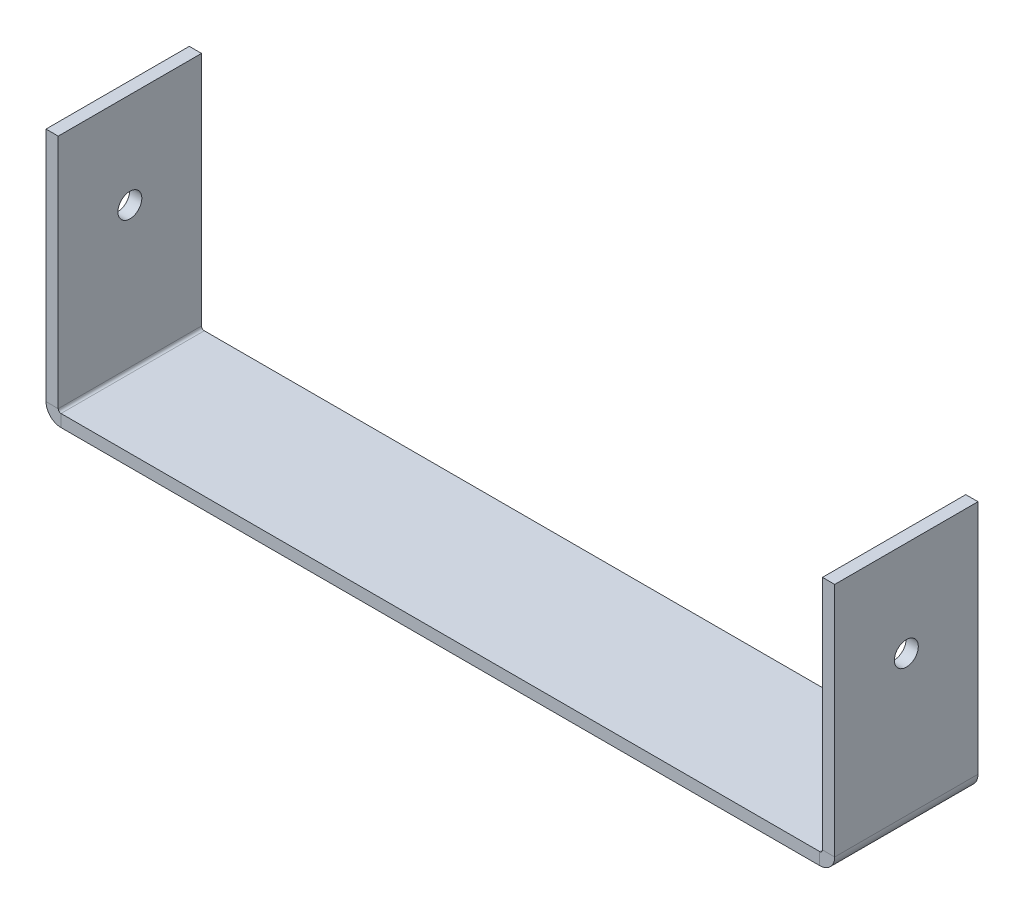
ISO-10303-21;
HEADER;
FILE_DESCRIPTION(('STEP AP214'),'2;1');
FILE_NAME('part.step','',(''),(''),'','','');
FILE_SCHEMA(('AUTOMOTIVE_DESIGN { 1 0 10303 214 1 1 1 1 }'));
ENDSEC;
DATA;
#1=APPLICATION_CONTEXT('core data for automotive mechanical design processes');
#2=APPLICATION_PROTOCOL_DEFINITION('international standard','automotive_design',2000,#1);
#3=PRODUCT_CONTEXT('',#1,'mechanical');
#4=PRODUCT('Part','Part','',(#3));
#5=PRODUCT_RELATED_PRODUCT_CATEGORY('part','',(#4));
#6=PRODUCT_DEFINITION_FORMATION('','',#4);
#7=PRODUCT_DEFINITION_CONTEXT('part definition',#1,'design');
#8=PRODUCT_DEFINITION('design','',#6,#7);
#9=PRODUCT_DEFINITION_SHAPE('','',#8);
#10=(LENGTH_UNIT() NAMED_UNIT(*) SI_UNIT(.MILLI.,.METRE.));
#11=(NAMED_UNIT(*) PLANE_ANGLE_UNIT() SI_UNIT($,.RADIAN.));
#12=(NAMED_UNIT(*) SI_UNIT($,.STERADIAN.) SOLID_ANGLE_UNIT());
#13=UNCERTAINTY_MEASURE_WITH_UNIT(LENGTH_MEASURE(1.E-05),#10,'distance_accuracy_value','');
#14=(GEOMETRIC_REPRESENTATION_CONTEXT(3) GLOBAL_UNCERTAINTY_ASSIGNED_CONTEXT((#13)) GLOBAL_UNIT_ASSIGNED_CONTEXT((#10,
#11,#12)) REPRESENTATION_CONTEXT('',''));
#15=CARTESIAN_POINT('',(0.,0.,0.));
#16=DIRECTION('',(0.,0.,1.));
#17=DIRECTION('',(1.,0.,0.));
#18=AXIS2_PLACEMENT_3D('',#15,#16,#17);
#19=CARTESIAN_POINT('',(-101.6,-3.2512,19.05));
#20=DIRECTION('',(0.,1.,0.));
#21=DIRECTION('',(0.,0.,1.));
#22=AXIS2_PLACEMENT_3D('',#19,#20,#21);
#23=PLANE('',#22);
#24=DIRECTION('',(0.,0.,-1.));
#25=VECTOR('',#24,1.);
#26=CARTESIAN_POINT('',(100.8634,-3.2512,-19.05));
#27=LINE('',#26,#25);
#28=CARTESIAN_POINT('',(100.8634,-3.2512,-19.05));
#29=VERTEX_POINT('',#28);
#30=CARTESIAN_POINT('',(100.8634,-3.2512,19.05));
#31=VERTEX_POINT('',#30);
#32=EDGE_CURVE('E135',#29,#31,#27,.F.);
#33=ORIENTED_EDGE('',*,*,#32,.T.);
#34=DIRECTION('',(1.,0.,0.));
#35=VECTOR('',#34,1.);
#36=CARTESIAN_POINT('',(-101.6,-3.2512,19.05));
#37=LINE('',#36,#35);
#38=CARTESIAN_POINT('',(-100.8634,-3.2512,19.05));
#39=VERTEX_POINT('',#38);
#40=EDGE_CURVE('E46',#39,#31,#37,.T.);
#41=ORIENTED_EDGE('',*,*,#40,.F.);
#42=DIRECTION('',(0.,0.,1.));
#43=VECTOR('',#42,1.);
#44=CARTESIAN_POINT('',(-100.8634,-3.2512,19.05));
#45=LINE('',#44,#43);
#46=CARTESIAN_POINT('',(-100.8634,-3.2512,-19.05));
#47=VERTEX_POINT('',#46);
#48=EDGE_CURVE('E224',#39,#47,#45,.F.);
#49=ORIENTED_EDGE('',*,*,#48,.T.);
#50=DIRECTION('',(-1.,0.,0.));
#51=VECTOR('',#50,1.);
#52=CARTESIAN_POINT('',(-101.6,-3.2512,-19.05));
#53=LINE('',#52,#51);
#54=EDGE_CURVE('E11',#29,#47,#53,.T.);
#55=ORIENTED_EDGE('',*,*,#54,.F.);
#56=EDGE_LOOP('',(#33,#41,#49,#55));
#57=FACE_BOUND('',#56,.T.);
#58=ADVANCED_FACE('F37',(#57),#23,.F.);
#59=CARTESIAN_POINT('',(-101.6,0.,19.05));
#60=DIRECTION('',(0.,1.,0.));
#61=DIRECTION('',(0.,0.,1.));
#62=AXIS2_PLACEMENT_3D('',#59,#60,#61);
#63=PLANE('',#62);
#64=DIRECTION('',(1.,0.,0.));
#65=VECTOR('',#64,1.);
#66=CARTESIAN_POINT('',(-101.6,0.,19.05));
#67=LINE('',#66,#65);
#68=CARTESIAN_POINT('',(-100.8634,0.,19.05));
#69=VERTEX_POINT('',#68);
#70=CARTESIAN_POINT('',(100.8634,0.,19.05));
#71=VERTEX_POINT('',#70);
#72=EDGE_CURVE('E242',#69,#71,#67,.T.);
#73=ORIENTED_EDGE('',*,*,#72,.T.);
#74=DIRECTION('',(0.,0.,-1.));
#75=VECTOR('',#74,1.);
#76=CARTESIAN_POINT('',(100.8634,0.,-19.05));
#77=LINE('',#76,#75);
#78=CARTESIAN_POINT('',(100.8634,0.,-19.05));
#79=VERTEX_POINT('',#78);
#80=EDGE_CURVE('E185',#79,#71,#77,.F.);
#81=ORIENTED_EDGE('',*,*,#80,.F.);
#82=DIRECTION('',(-1.,0.,0.));
#83=VECTOR('',#82,1.);
#84=CARTESIAN_POINT('',(-101.6,0.,-19.05));
#85=LINE('',#84,#83);
#86=CARTESIAN_POINT('',(-100.8634,0.,-19.05));
#87=VERTEX_POINT('',#86);
#88=EDGE_CURVE('E246',#79,#87,#85,.T.);
#89=ORIENTED_EDGE('',*,*,#88,.T.);
#90=DIRECTION('',(0.,0.,1.));
#91=VECTOR('',#90,1.);
#92=CARTESIAN_POINT('',(-100.8634,0.,19.05));
#93=LINE('',#92,#91);
#94=EDGE_CURVE('E54',#69,#87,#93,.F.);
#95=ORIENTED_EDGE('',*,*,#94,.F.);
#96=EDGE_LOOP('',(#73,#81,#89,#95));
#97=FACE_BOUND('',#96,.T.);
#98=ADVANCED_FACE('F249',(#97),#63,.T.);
#99=CARTESIAN_POINT('',(-101.6,-3.2512,-19.05));
#100=DIRECTION('',(0.,0.,-1.));
#101=DIRECTION('',(-1.,0.,0.));
#102=AXIS2_PLACEMENT_3D('',#99,#100,#101);
#103=PLANE('',#102);
#104=ORIENTED_EDGE('',*,*,#88,.F.);
#105=DIRECTION('',(0.,-1.,0.));
#106=VECTOR('',#105,1.);
#107=CARTESIAN_POINT('',(100.8634,0.,-19.05));
#108=LINE('',#107,#106);
#109=EDGE_CURVE('E181',#79,#29,#108,.T.);
#110=ORIENTED_EDGE('',*,*,#109,.T.);
#111=ORIENTED_EDGE('',*,*,#54,.T.);
#112=DIRECTION('',(0.,-1.,0.));
#113=VECTOR('',#112,1.);
#114=CARTESIAN_POINT('',(-100.8634,0.,-19.05));
#115=LINE('',#114,#113);
#116=EDGE_CURVE('E239',#87,#47,#115,.T.);
#117=ORIENTED_EDGE('',*,*,#116,.F.);
#118=EDGE_LOOP('',(#104,#110,#111,#117));
#119=FACE_BOUND('',#118,.T.);
#120=ADVANCED_FACE('F250',(#119),#103,.T.);
#121=CARTESIAN_POINT('',(-101.6,-3.2512,19.05));
#122=DIRECTION('',(0.,0.,1.));
#123=DIRECTION('',(1.,0.,0.));
#124=AXIS2_PLACEMENT_3D('',#121,#122,#123);
#125=PLANE('',#124);
#126=DIRECTION('',(0.,-1.,0.));
#127=VECTOR('',#126,1.);
#128=CARTESIAN_POINT('',(100.8634,0.,19.05));
#129=LINE('',#128,#127);
#130=EDGE_CURVE('E189',#71,#31,#129,.T.);
#131=ORIENTED_EDGE('',*,*,#130,.F.);
#132=ORIENTED_EDGE('',*,*,#72,.F.);
#133=DIRECTION('',(0.,-1.,0.));
#134=VECTOR('',#133,1.);
#135=CARTESIAN_POINT('',(-100.8634,0.,19.05));
#136=LINE('',#135,#134);
#137=EDGE_CURVE('E230',#69,#39,#136,.T.);
#138=ORIENTED_EDGE('',*,*,#137,.T.);
#139=ORIENTED_EDGE('',*,*,#40,.T.);
#140=EDGE_LOOP('',(#131,#132,#138,#139));
#141=FACE_BOUND('',#140,.T.);
#142=ADVANCED_FACE('F39',(#141),#125,.T.);
#143=CARTESIAN_POINT('',(-100.8634,0.736600000000006,-19.05));
#144=DIRECTION('',(0.,0.,-1.));
#145=DIRECTION('',(-1.,0.,0.));
#146=AXIS2_PLACEMENT_3D('',#143,#144,#145);
#147=PLANE('',#146);
#148=DIRECTION('',(-1.,0.,0.));
#149=VECTOR('',#148,1.);
#150=CARTESIAN_POINT('',(-101.6,0.736600000000004,-19.05));
#151=LINE('',#150,#149);
#152=CARTESIAN_POINT('',(-101.6,0.736600000000004,-19.05));
#153=VERTEX_POINT('',#152);
#154=CARTESIAN_POINT('',(-104.8512,0.736599999999992,-19.05));
#155=VERTEX_POINT('',#154);
#156=EDGE_CURVE('E192',#153,#155,#151,.T.);
#157=ORIENTED_EDGE('',*,*,#156,.F.);
#158=CARTESIAN_POINT('',(-100.8634,0.736600000000006,-19.05));
#159=DIRECTION('',(0.,0.,1.));
#160=DIRECTION('',(1.,0.,0.));
#161=AXIS2_PLACEMENT_3D('',#158,#159,#160);
#162=CIRCLE('',#161,0.736600000000004);
#163=EDGE_CURVE('E233',#87,#153,#162,.F.);
#164=ORIENTED_EDGE('',*,*,#163,.F.);
#165=ORIENTED_EDGE('',*,*,#116,.T.);
#166=CARTESIAN_POINT('',(-100.8634,0.736600000000006,-19.05));
#167=DIRECTION('',(0.,0.,1.));
#168=DIRECTION('',(1.,0.,0.));
#169=AXIS2_PLACEMENT_3D('',#166,#167,#168);
#170=CIRCLE('',#169,3.9878);
#171=EDGE_CURVE('E226',#47,#155,#170,.F.);
#172=ORIENTED_EDGE('',*,*,#171,.T.);
#173=EDGE_LOOP('',(#157,#164,#165,#172));
#174=FACE_BOUND('',#173,.T.);
#175=ADVANCED_FACE('F258',(#174),#147,.T.);
#176=CARTESIAN_POINT('',(-100.8634,0.736600000000006,19.05));
#177=DIRECTION('',(0.,0.,-1.));
#178=DIRECTION('',(-1.,0.,0.));
#179=AXIS2_PLACEMENT_3D('',#176,#177,#178);
#180=PLANE('',#179);
#181=CARTESIAN_POINT('',(-100.8634,0.736600000000006,19.05));
#182=DIRECTION('',(0.,0.,1.));
#183=DIRECTION('',(1.,0.,0.));
#184=AXIS2_PLACEMENT_3D('',#181,#182,#183);
#185=CIRCLE('',#184,0.736600000000004);
#186=CARTESIAN_POINT('',(-101.6,0.736600000000004,19.05));
#187=VERTEX_POINT('',#186);
#188=EDGE_CURVE('E223',#187,#69,#185,.T.);
#189=ORIENTED_EDGE('',*,*,#188,.F.);
#190=DIRECTION('',(-1.,0.,0.));
#191=VECTOR('',#190,1.);
#192=CARTESIAN_POINT('',(-101.6,0.736600000000004,19.05));
#193=LINE('',#192,#191);
#194=CARTESIAN_POINT('',(-104.8512,0.736599999999992,19.05));
#195=VERTEX_POINT('',#194);
#196=EDGE_CURVE('E196',#187,#195,#193,.T.);
#197=ORIENTED_EDGE('',*,*,#196,.T.);
#198=CARTESIAN_POINT('',(-100.8634,0.736600000000006,19.05));
#199=DIRECTION('',(0.,0.,1.));
#200=DIRECTION('',(1.,0.,0.));
#201=AXIS2_PLACEMENT_3D('',#198,#199,#200);
#202=CIRCLE('',#201,3.9878);
#203=EDGE_CURVE('E227',#195,#39,#202,.T.);
#204=ORIENTED_EDGE('',*,*,#203,.T.);
#205=ORIENTED_EDGE('',*,*,#137,.F.);
#206=EDGE_LOOP('',(#189,#197,#204,#205));
#207=FACE_BOUND('',#206,.T.);
#208=ADVANCED_FACE('F279',(#207),#180,.F.);
#209=CARTESIAN_POINT('',(-100.8634,0.736600000000006,19.05));
#210=DIRECTION('',(0.,0.,1.));
#211=DIRECTION('',(-1.,0.,0.));
#212=AXIS2_PLACEMENT_3D('',#209,#210,#211);
#213=CYLINDRICAL_SURFACE('',#212,3.9878);
#214=ORIENTED_EDGE('',*,*,#48,.F.);
#215=ORIENTED_EDGE('',*,*,#203,.F.);
#216=DIRECTION('',(0.,0.,-1.));
#217=VECTOR('',#216,1.);
#218=CARTESIAN_POINT('',(-104.8512,0.73659999999999,-19.05));
#219=LINE('',#218,#217);
#220=EDGE_CURVE('E199',#195,#155,#219,.T.);
#221=ORIENTED_EDGE('',*,*,#220,.T.);
#222=ORIENTED_EDGE('',*,*,#171,.F.);
#223=EDGE_LOOP('',(#214,#215,#221,#222));
#224=FACE_BOUND('',#223,.T.);
#225=ADVANCED_FACE('F500',(#224),#213,.T.);
#226=CARTESIAN_POINT('',(-100.8634,0.736600000000006,19.05));
#227=DIRECTION('',(0.,0.,1.));
#228=DIRECTION('',(-1.,0.,0.));
#229=AXIS2_PLACEMENT_3D('',#226,#227,#228);
#230=CYLINDRICAL_SURFACE('',#229,0.736600000000004);
#231=ORIENTED_EDGE('',*,*,#94,.T.);
#232=ORIENTED_EDGE('',*,*,#163,.T.);
#233=DIRECTION('',(0.,0.,1.));
#234=VECTOR('',#233,1.);
#235=CARTESIAN_POINT('',(-101.6,0.736600000000004,-19.05));
#236=LINE('',#235,#234);
#237=EDGE_CURVE('E194',#153,#187,#236,.T.);
#238=ORIENTED_EDGE('',*,*,#237,.T.);
#239=ORIENTED_EDGE('',*,*,#188,.T.);
#240=EDGE_LOOP('',(#231,#232,#238,#239));
#241=FACE_BOUND('',#240,.T.);
#242=ADVANCED_FACE('F255',(#241),#230,.F.);
#243=CARTESIAN_POINT('',(-104.8512,0.,-19.05));
#244=DIRECTION('',(0.,0.,1.));
#245=DIRECTION('',(1.,0.,0.));
#246=AXIS2_PLACEMENT_3D('',#243,#244,#245);
#247=PLANE('',#246);
#248=ORIENTED_EDGE('',*,*,#156,.T.);
#249=DIRECTION('',(0.,-1.,0.));
#250=VECTOR('',#249,1.);
#251=CARTESIAN_POINT('',(-104.8512,0.,-19.05));
#252=LINE('',#251,#250);
#253=CARTESIAN_POINT('',(-104.8512,63.5,-19.05));
#254=VERTEX_POINT('',#253);
#255=EDGE_CURVE('E204',#254,#155,#252,.T.);
#256=ORIENTED_EDGE('',*,*,#255,.F.);
#257=DIRECTION('',(1.,0.,0.));
#258=VECTOR('',#257,1.);
#259=CARTESIAN_POINT('',(-104.8512,63.5,-19.05));
#260=LINE('',#259,#258);
#261=CARTESIAN_POINT('',(-101.6,63.5,-19.05));
#262=VERTEX_POINT('',#261);
#263=EDGE_CURVE('E212',#254,#262,#260,.T.);
#264=ORIENTED_EDGE('',*,*,#263,.T.);
#265=DIRECTION('',(0.,-1.,0.));
#266=VECTOR('',#265,1.);
#267=CARTESIAN_POINT('',(-101.6,0.,-19.05));
#268=LINE('',#267,#266);
#269=EDGE_CURVE('E203',#262,#153,#268,.T.);
#270=ORIENTED_EDGE('',*,*,#269,.T.);
#271=EDGE_LOOP('',(#248,#256,#264,#270));
#272=FACE_BOUND('',#271,.T.);
#273=ADVANCED_FACE('F261',(#272),#247,.F.);
#274=CARTESIAN_POINT('',(-104.8512,63.5,19.05));
#275=DIRECTION('',(0.,0.,-1.));
#276=DIRECTION('',(0.,1.,0.));
#277=AXIS2_PLACEMENT_3D('',#274,#275,#276);
#278=PLANE('',#277);
#279=ORIENTED_EDGE('',*,*,#196,.F.);
#280=DIRECTION('',(0.,1.,0.));
#281=VECTOR('',#280,1.);
#282=CARTESIAN_POINT('',(-101.6,63.5,19.05));
#283=LINE('',#282,#281);
#284=CARTESIAN_POINT('',(-101.6,63.5,19.05));
#285=VERTEX_POINT('',#284);
#286=EDGE_CURVE('E215',#187,#285,#283,.T.);
#287=ORIENTED_EDGE('',*,*,#286,.T.);
#288=DIRECTION('',(1.,0.,0.));
#289=VECTOR('',#288,1.);
#290=CARTESIAN_POINT('',(-104.8512,63.5,19.05));
#291=LINE('',#290,#289);
#292=CARTESIAN_POINT('',(-104.8512,63.5,19.05));
#293=VERTEX_POINT('',#292);
#294=EDGE_CURVE('E220',#293,#285,#291,.T.);
#295=ORIENTED_EDGE('',*,*,#294,.F.);
#296=DIRECTION('',(0.,1.,0.));
#297=VECTOR('',#296,1.);
#298=CARTESIAN_POINT('',(-104.8512,63.5,19.05));
#299=LINE('',#298,#297);
#300=EDGE_CURVE('E207',#195,#293,#299,.T.);
#301=ORIENTED_EDGE('',*,*,#300,.F.);
#302=EDGE_LOOP('',(#279,#287,#295,#301));
#303=FACE_BOUND('',#302,.T.);
#304=ADVANCED_FACE('F281',(#303),#278,.F.);
#305=CARTESIAN_POINT('',(-104.8512,63.5,-19.05));
#306=DIRECTION('',(1.,0.,0.));
#307=DIRECTION('',(0.,1.,0.));
#308=AXIS2_PLACEMENT_3D('',#305,#306,#307);
#309=PLANE('',#308);
#310=CARTESIAN_POINT('',(-104.8512,38.1,0.));
#311=DIRECTION('',(-1.,0.,0.));
#312=DIRECTION('',(0.,-1.,0.));
#313=AXIS2_PLACEMENT_3D('',#310,#311,#312);
#314=CIRCLE('',#313,3.175);
#315=CARTESIAN_POINT('',(-104.8512,34.925,0.));
#316=VERTEX_POINT('',#315);
#317=EDGE_CURVE('E324',#316,#316,#314,.T.);
#318=ORIENTED_EDGE('',*,*,#317,.F.);
#319=EDGE_LOOP('',(#318));
#320=FACE_BOUND('',#319,.T.);
#321=ORIENTED_EDGE('',*,*,#220,.F.);
#322=ORIENTED_EDGE('',*,*,#300,.T.);
#323=DIRECTION('',(0.,0.,-1.));
#324=VECTOR('',#323,1.);
#325=CARTESIAN_POINT('',(-104.8512,63.5,-19.05));
#326=LINE('',#325,#324);
#327=EDGE_CURVE('E210',#293,#254,#326,.T.);
#328=ORIENTED_EDGE('',*,*,#327,.T.);
#329=ORIENTED_EDGE('',*,*,#255,.T.);
#330=EDGE_LOOP('',(#321,#322,#328,#329));
#331=FACE_BOUND('',#330,.T.);
#332=ADVANCED_FACE('F265',(#320,#331),#309,.F.);
#333=CARTESIAN_POINT('',(-101.6,63.5,-19.05));
#334=DIRECTION('',(1.,0.,0.));
#335=DIRECTION('',(0.,1.,0.));
#336=AXIS2_PLACEMENT_3D('',#333,#334,#335);
#337=PLANE('',#336);
#338=CARTESIAN_POINT('',(-101.6,38.1,0.));
#339=DIRECTION('',(1.,0.,0.));
#340=DIRECTION('',(0.,1.,0.));
#341=AXIS2_PLACEMENT_3D('',#338,#339,#340);
#342=CIRCLE('',#341,3.175);
#343=CARTESIAN_POINT('',(-101.6,41.275,0.));
#344=VERTEX_POINT('',#343);
#345=EDGE_CURVE('E318',#344,#344,#342,.T.);
#346=ORIENTED_EDGE('',*,*,#345,.F.);
#347=EDGE_LOOP('',(#346));
#348=FACE_BOUND('',#347,.T.);
#349=ORIENTED_EDGE('',*,*,#286,.F.);
#350=ORIENTED_EDGE('',*,*,#237,.F.);
#351=ORIENTED_EDGE('',*,*,#269,.F.);
#352=DIRECTION('',(0.,0.,-1.));
#353=VECTOR('',#352,1.);
#354=CARTESIAN_POINT('',(-101.6,63.5,-19.05));
#355=LINE('',#354,#353);
#356=EDGE_CURVE('E208',#285,#262,#355,.T.);
#357=ORIENTED_EDGE('',*,*,#356,.F.);
#358=EDGE_LOOP('',(#349,#350,#351,#357));
#359=FACE_BOUND('',#358,.T.);
#360=ADVANCED_FACE('F275',(#348,#359),#337,.T.);
#361=CARTESIAN_POINT('',(-104.8512,63.5,-19.05));
#362=DIRECTION('',(0.,-1.,0.));
#363=DIRECTION('',(1.,0.,0.));
#364=AXIS2_PLACEMENT_3D('',#361,#362,#363);
#365=PLANE('',#364);
#366=ORIENTED_EDGE('',*,*,#356,.T.);
#367=ORIENTED_EDGE('',*,*,#263,.F.);
#368=ORIENTED_EDGE('',*,*,#327,.F.);
#369=ORIENTED_EDGE('',*,*,#294,.T.);
#370=EDGE_LOOP('',(#366,#367,#368,#369));
#371=FACE_BOUND('',#370,.T.);
#372=ADVANCED_FACE('F271',(#371),#365,.F.);
#373=CARTESIAN_POINT('',(100.8634,0.736600000000006,19.05));
#374=DIRECTION('',(0.,0.,1.));
#375=DIRECTION('',(1.,0.,0.));
#376=AXIS2_PLACEMENT_3D('',#373,#374,#375);
#377=PLANE('',#376);
#378=DIRECTION('',(1.,0.,0.));
#379=VECTOR('',#378,1.);
#380=CARTESIAN_POINT('',(101.6,0.736600000000004,19.05));
#381=LINE('',#380,#379);
#382=CARTESIAN_POINT('',(101.6,0.736600000000004,19.05));
#383=VERTEX_POINT('',#382);
#384=CARTESIAN_POINT('',(104.8512,0.736599999999992,19.05));
#385=VERTEX_POINT('',#384);
#386=EDGE_CURVE('E316',#383,#385,#381,.T.);
#387=ORIENTED_EDGE('',*,*,#386,.F.);
#388=CARTESIAN_POINT('',(100.8634,0.736600000000006,19.05));
#389=DIRECTION('',(0.,0.,-1.));
#390=DIRECTION('',(-1.,0.,0.));
#391=AXIS2_PLACEMENT_3D('',#388,#389,#390);
#392=CIRCLE('',#391,0.736600000000004);
#393=EDGE_CURVE('E138',#71,#383,#392,.F.);
#394=ORIENTED_EDGE('',*,*,#393,.F.);
#395=ORIENTED_EDGE('',*,*,#130,.T.);
#396=CARTESIAN_POINT('',(100.8634,0.736600000000006,19.05));
#397=DIRECTION('',(0.,0.,-1.));
#398=DIRECTION('',(-1.,0.,0.));
#399=AXIS2_PLACEMENT_3D('',#396,#397,#398);
#400=CIRCLE('',#399,3.9878);
#401=EDGE_CURVE('E180',#31,#385,#400,.F.);
#402=ORIENTED_EDGE('',*,*,#401,.T.);
#403=EDGE_LOOP('',(#387,#394,#395,#402));
#404=FACE_BOUND('',#403,.T.);
#405=ADVANCED_FACE('F314',(#404),#377,.T.);
#406=CARTESIAN_POINT('',(100.8634,0.736600000000006,-19.05));
#407=DIRECTION('',(0.,0.,1.));
#408=DIRECTION('',(1.,0.,0.));
#409=AXIS2_PLACEMENT_3D('',#406,#407,#408);
#410=PLANE('',#409);
#411=CARTESIAN_POINT('',(100.8634,0.736600000000006,-19.05));
#412=DIRECTION('',(0.,0.,-1.));
#413=DIRECTION('',(-1.,0.,0.));
#414=AXIS2_PLACEMENT_3D('',#411,#412,#413);
#415=CIRCLE('',#414,0.736600000000004);
#416=CARTESIAN_POINT('',(101.6,0.736600000000004,-19.05));
#417=VERTEX_POINT('',#416);
#418=EDGE_CURVE('E145',#417,#79,#415,.T.);
#419=ORIENTED_EDGE('',*,*,#418,.F.);
#420=DIRECTION('',(1.,0.,0.));
#421=VECTOR('',#420,1.);
#422=CARTESIAN_POINT('',(101.6,0.736600000000004,-19.05));
#423=LINE('',#422,#421);
#424=CARTESIAN_POINT('',(104.8512,0.736599999999992,-19.05));
#425=VERTEX_POINT('',#424);
#426=EDGE_CURVE('E142',#417,#425,#423,.T.);
#427=ORIENTED_EDGE('',*,*,#426,.T.);
#428=CARTESIAN_POINT('',(100.8634,0.736600000000006,-19.05));
#429=DIRECTION('',(0.,0.,-1.));
#430=DIRECTION('',(-1.,0.,0.));
#431=AXIS2_PLACEMENT_3D('',#428,#429,#430);
#432=CIRCLE('',#431,3.9878);
#433=EDGE_CURVE('E128',#425,#29,#432,.T.);
#434=ORIENTED_EDGE('',*,*,#433,.T.);
#435=ORIENTED_EDGE('',*,*,#109,.F.);
#436=EDGE_LOOP('',(#419,#427,#434,#435));
#437=FACE_BOUND('',#436,.T.);
#438=ADVANCED_FACE('F143',(#437),#410,.F.);
#439=CARTESIAN_POINT('',(100.8634,0.736600000000006,-19.05));
#440=DIRECTION('',(0.,0.,-1.));
#441=DIRECTION('',(1.,0.,0.));
#442=AXIS2_PLACEMENT_3D('',#439,#440,#441);
#443=CYLINDRICAL_SURFACE('',#442,3.9878);
#444=ORIENTED_EDGE('',*,*,#32,.F.);
#445=ORIENTED_EDGE('',*,*,#433,.F.);
#446=DIRECTION('',(0.,0.,1.));
#447=VECTOR('',#446,1.);
#448=CARTESIAN_POINT('',(104.8512,0.73659999999999,19.05));
#449=LINE('',#448,#447);
#450=EDGE_CURVE('E133',#425,#385,#449,.T.);
#451=ORIENTED_EDGE('',*,*,#450,.T.);
#452=ORIENTED_EDGE('',*,*,#401,.F.);
#453=EDGE_LOOP('',(#444,#445,#451,#452));
#454=FACE_BOUND('',#453,.T.);
#455=ADVANCED_FACE('F130',(#454),#443,.T.);
#456=CARTESIAN_POINT('',(100.8634,0.736600000000006,-19.05));
#457=DIRECTION('',(0.,0.,-1.));
#458=DIRECTION('',(1.,0.,0.));
#459=AXIS2_PLACEMENT_3D('',#456,#457,#458);
#460=CYLINDRICAL_SURFACE('',#459,0.736600000000004);
#461=ORIENTED_EDGE('',*,*,#80,.T.);
#462=ORIENTED_EDGE('',*,*,#393,.T.);
#463=DIRECTION('',(0.,0.,-1.));
#464=VECTOR('',#463,1.);
#465=CARTESIAN_POINT('',(101.6,0.736600000000004,19.05));
#466=LINE('',#465,#464);
#467=EDGE_CURVE('E149',#383,#417,#466,.T.);
#468=ORIENTED_EDGE('',*,*,#467,.T.);
#469=ORIENTED_EDGE('',*,*,#418,.T.);
#470=EDGE_LOOP('',(#461,#462,#468,#469));
#471=FACE_BOUND('',#470,.T.);
#472=ADVANCED_FACE('F312',(#471),#460,.F.);
#473=CARTESIAN_POINT('',(104.8512,0.,19.05));
#474=DIRECTION('',(0.,0.,-1.));
#475=DIRECTION('',(-1.,0.,0.));
#476=AXIS2_PLACEMENT_3D('',#473,#474,#475);
#477=PLANE('',#476);
#478=ORIENTED_EDGE('',*,*,#386,.T.);
#479=DIRECTION('',(0.,-1.,0.));
#480=VECTOR('',#479,1.);
#481=CARTESIAN_POINT('',(104.8512,0.,19.05));
#482=LINE('',#481,#480);
#483=CARTESIAN_POINT('',(104.8512,63.5,19.05));
#484=VERTEX_POINT('',#483);
#485=EDGE_CURVE('E157',#484,#385,#482,.T.);
#486=ORIENTED_EDGE('',*,*,#485,.F.);
#487=DIRECTION('',(-1.,0.,0.));
#488=VECTOR('',#487,1.);
#489=CARTESIAN_POINT('',(104.8512,63.5,19.05));
#490=LINE('',#489,#488);
#491=CARTESIAN_POINT('',(101.6,63.5,19.05));
#492=VERTEX_POINT('',#491);
#493=EDGE_CURVE('E166',#484,#492,#490,.T.);
#494=ORIENTED_EDGE('',*,*,#493,.T.);
#495=DIRECTION('',(0.,-1.,0.));
#496=VECTOR('',#495,1.);
#497=CARTESIAN_POINT('',(101.6,0.,19.05));
#498=LINE('',#497,#496);
#499=EDGE_CURVE('E158',#492,#383,#498,.T.);
#500=ORIENTED_EDGE('',*,*,#499,.T.);
#501=EDGE_LOOP('',(#478,#486,#494,#500));
#502=FACE_BOUND('',#501,.T.);
#503=ADVANCED_FACE('F346',(#502),#477,.F.);
#504=CARTESIAN_POINT('',(104.8512,63.5,-19.05));
#505=DIRECTION('',(0.,0.,1.));
#506=DIRECTION('',(1.,0.,0.));
#507=AXIS2_PLACEMENT_3D('',#504,#505,#506);
#508=PLANE('',#507);
#509=ORIENTED_EDGE('',*,*,#426,.F.);
#510=DIRECTION('',(0.,1.,0.));
#511=VECTOR('',#510,1.);
#512=CARTESIAN_POINT('',(101.6,63.5,-19.05));
#513=LINE('',#512,#511);
#514=CARTESIAN_POINT('',(101.6,63.5,-19.05));
#515=VERTEX_POINT('',#514);
#516=EDGE_CURVE('E173',#417,#515,#513,.T.);
#517=ORIENTED_EDGE('',*,*,#516,.T.);
#518=DIRECTION('',(-1.,0.,0.));
#519=VECTOR('',#518,1.);
#520=CARTESIAN_POINT('',(104.8512,63.5,-19.05));
#521=LINE('',#520,#519);
#522=CARTESIAN_POINT('',(104.8512,63.5,-19.05));
#523=VERTEX_POINT('',#522);
#524=EDGE_CURVE('E162',#523,#515,#521,.T.);
#525=ORIENTED_EDGE('',*,*,#524,.F.);
#526=DIRECTION('',(0.,1.,0.));
#527=VECTOR('',#526,1.);
#528=CARTESIAN_POINT('',(104.8512,63.5,-19.05));
#529=LINE('',#528,#527);
#530=EDGE_CURVE('E154',#425,#523,#529,.T.);
#531=ORIENTED_EDGE('',*,*,#530,.F.);
#532=EDGE_LOOP('',(#509,#517,#525,#531));
#533=FACE_BOUND('',#532,.T.);
#534=ADVANCED_FACE('F160',(#533),#508,.F.);
#535=CARTESIAN_POINT('',(104.8512,63.5,19.05));
#536=DIRECTION('',(-1.,0.,0.));
#537=DIRECTION('',(0.,-1.,0.));
#538=AXIS2_PLACEMENT_3D('',#535,#536,#537);
#539=PLANE('',#538);
#540=CARTESIAN_POINT('',(104.8512,38.1000000000007,0.));
#541=DIRECTION('',(-1.,0.,0.));
#542=DIRECTION('',(0.,-1.,0.));
#543=AXIS2_PLACEMENT_3D('',#540,#541,#542);
#544=CIRCLE('',#543,3.175);
#545=CARTESIAN_POINT('',(104.8512,34.9250000000007,0.));
#546=VERTEX_POINT('',#545);
#547=EDGE_CURVE('E327',#546,#546,#544,.T.);
#548=ORIENTED_EDGE('',*,*,#547,.T.);
#549=EDGE_LOOP('',(#548));
#550=FACE_BOUND('',#549,.T.);
#551=ORIENTED_EDGE('',*,*,#450,.F.);
#552=ORIENTED_EDGE('',*,*,#530,.T.);
#553=DIRECTION('',(0.,0.,1.));
#554=VECTOR('',#553,1.);
#555=CARTESIAN_POINT('',(104.8512,63.5,19.05));
#556=LINE('',#555,#554);
#557=EDGE_CURVE('E164',#523,#484,#556,.T.);
#558=ORIENTED_EDGE('',*,*,#557,.T.);
#559=ORIENTED_EDGE('',*,*,#485,.T.);
#560=EDGE_LOOP('',(#551,#552,#558,#559));
#561=FACE_BOUND('',#560,.T.);
#562=ADVANCED_FACE('F153',(#550,#561),#539,.F.);
#563=CARTESIAN_POINT('',(101.6,63.5,19.05));
#564=DIRECTION('',(-1.,0.,0.));
#565=DIRECTION('',(0.,-1.,0.));
#566=AXIS2_PLACEMENT_3D('',#563,#564,#565);
#567=PLANE('',#566);
#568=CARTESIAN_POINT('',(101.6,38.1000000000007,0.));
#569=DIRECTION('',(-1.,0.,0.));
#570=DIRECTION('',(0.,-1.,0.));
#571=AXIS2_PLACEMENT_3D('',#568,#569,#570);
#572=CIRCLE('',#571,3.175);
#573=CARTESIAN_POINT('',(101.6,34.9250000000007,0.));
#574=VERTEX_POINT('',#573);
#575=EDGE_CURVE('E41',#574,#574,#572,.T.);
#576=ORIENTED_EDGE('',*,*,#575,.F.);
#577=EDGE_LOOP('',(#576));
#578=FACE_BOUND('',#577,.T.);
#579=ORIENTED_EDGE('',*,*,#516,.F.);
#580=ORIENTED_EDGE('',*,*,#467,.F.);
#581=ORIENTED_EDGE('',*,*,#499,.F.);
#582=DIRECTION('',(0.,0.,1.));
#583=VECTOR('',#582,1.);
#584=CARTESIAN_POINT('',(101.6,63.5,19.05));
#585=LINE('',#584,#583);
#586=EDGE_CURVE('E168',#515,#492,#585,.T.);
#587=ORIENTED_EDGE('',*,*,#586,.F.);
#588=EDGE_LOOP('',(#579,#580,#581,#587));
#589=FACE_BOUND('',#588,.T.);
#590=ADVANCED_FACE('F337',(#578,#589),#567,.T.);
#591=CARTESIAN_POINT('',(104.8512,63.5,19.05));
#592=DIRECTION('',(0.,-1.,0.));
#593=DIRECTION('',(1.,0.,0.));
#594=AXIS2_PLACEMENT_3D('',#591,#592,#593);
#595=PLANE('',#594);
#596=ORIENTED_EDGE('',*,*,#586,.T.);
#597=ORIENTED_EDGE('',*,*,#493,.F.);
#598=ORIENTED_EDGE('',*,*,#557,.F.);
#599=ORIENTED_EDGE('',*,*,#524,.T.);
#600=EDGE_LOOP('',(#596,#597,#598,#599));
#601=FACE_BOUND('',#600,.T.);
#602=ADVANCED_FACE('F340',(#601),#595,.F.);
#603=CARTESIAN_POINT('',(104.8512,38.1000000000007,0.));
#604=DIRECTION('',(-1.,0.,0.));
#605=DIRECTION('',(0.,-1.,0.));
#606=AXIS2_PLACEMENT_3D('',#603,#604,#605);
#607=CYLINDRICAL_SURFACE('',#606,3.175);
#608=ORIENTED_EDGE('',*,*,#575,.T.);
#609=EDGE_LOOP('',(#608));
#610=FACE_BOUND('',#609,.T.);
#611=ORIENTED_EDGE('',*,*,#547,.F.);
#612=EDGE_LOOP('',(#611));
#613=FACE_BOUND('',#612,.T.);
#614=ADVANCED_FACE('F334',(#610,#613),#607,.F.);
#615=ORIENTED_EDGE('',*,*,#345,.T.);
#616=EDGE_LOOP('',(#615));
#617=FACE_BOUND('',#616,.T.);
#618=ORIENTED_EDGE('',*,*,#317,.T.);
#619=EDGE_LOOP('',(#618));
#620=FACE_BOUND('',#619,.T.);
#621=ADVANCED_FACE('F445',(#617,#620),#607,.F.);
#622=CLOSED_SHELL('',(#58,#98,#120,#142,#175,#208,#225,#242,#273,#304,#332,#360,#372,#405,#438,
#455,#472,#503,#534,#562,#590,#602,#614,#621));
#623=MANIFOLD_SOLID_BREP('B2',#622);
#624=ADVANCED_BREP_SHAPE_REPRESENTATION('',(#18,#623),#14);
#625=SHAPE_DEFINITION_REPRESENTATION(#9,#624);
ENDSEC;
END-ISO-10303-21;
